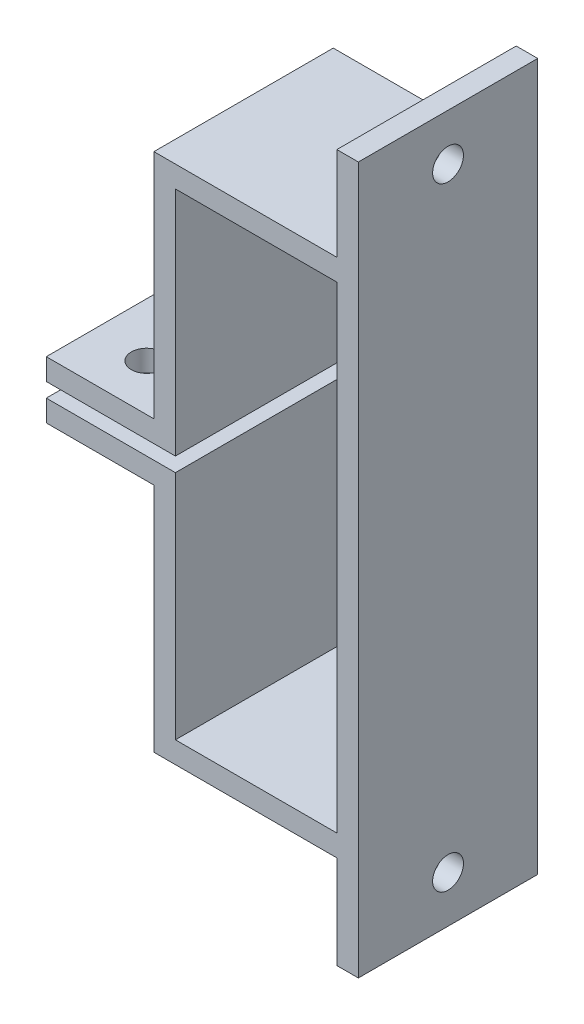
ISO-10303-21;
HEADER;
FILE_DESCRIPTION(('STEP AP214'),'2;1');
FILE_NAME('part.step','',(''),(''),'','','');
FILE_SCHEMA(('AUTOMOTIVE_DESIGN { 1 0 10303 214 1 1 1 1 }'));
ENDSEC;
DATA;
#1=APPLICATION_CONTEXT('core data for automotive mechanical design processes');
#2=APPLICATION_PROTOCOL_DEFINITION('international standard','automotive_design',2000,#1);
#3=PRODUCT_CONTEXT('',#1,'mechanical');
#4=PRODUCT('Part','Part','',(#3));
#5=PRODUCT_RELATED_PRODUCT_CATEGORY('part','',(#4));
#6=PRODUCT_DEFINITION_FORMATION('','',#4);
#7=PRODUCT_DEFINITION_CONTEXT('part definition',#1,'design');
#8=PRODUCT_DEFINITION('design','',#6,#7);
#9=PRODUCT_DEFINITION_SHAPE('','',#8);
#10=(LENGTH_UNIT() NAMED_UNIT(*) SI_UNIT(.MILLI.,.METRE.));
#11=(NAMED_UNIT(*) PLANE_ANGLE_UNIT() SI_UNIT($,.RADIAN.));
#12=(NAMED_UNIT(*) SI_UNIT($,.STERADIAN.) SOLID_ANGLE_UNIT());
#13=UNCERTAINTY_MEASURE_WITH_UNIT(LENGTH_MEASURE(1.E-05),#10,'distance_accuracy_value','');
#14=(GEOMETRIC_REPRESENTATION_CONTEXT(3) GLOBAL_UNCERTAINTY_ASSIGNED_CONTEXT((#13)) GLOBAL_UNIT_ASSIGNED_CONTEXT((#10,
#11,#12)) REPRESENTATION_CONTEXT('',''));
#15=CARTESIAN_POINT('',(0.,0.,0.));
#16=DIRECTION('',(0.,0.,1.));
#17=DIRECTION('',(1.,0.,0.));
#18=AXIS2_PLACEMENT_3D('',#15,#16,#17);
#19=CARTESIAN_POINT('',(-28.5,0.,25.));
#20=DIRECTION('',(0.,-1.,0.));
#21=DIRECTION('',(1.,0.,0.));
#22=AXIS2_PLACEMENT_3D('',#19,#20,#21);
#23=PLANE('',#22);
#24=DIRECTION('',(-1.,0.,0.));
#25=VECTOR('',#24,1.);
#26=CARTESIAN_POINT('',(-28.5,0.,25.));
#27=LINE('',#26,#25);
#28=CARTESIAN_POINT('',(-3.,0.,25.));
#29=VERTEX_POINT('',#28);
#30=CARTESIAN_POINT('',(-28.5,0.,25.));
#31=VERTEX_POINT('',#30);
#32=EDGE_CURVE('E196',#29,#31,#27,.T.);
#33=ORIENTED_EDGE('',*,*,#32,.F.);
#34=DIRECTION('',(0.,0.,-1.));
#35=VECTOR('',#34,1.);
#36=CARTESIAN_POINT('',(-3.,0.,25.));
#37=LINE('',#36,#35);
#38=CARTESIAN_POINT('',(-3.00000000000001,0.,0.));
#39=VERTEX_POINT('',#38);
#40=EDGE_CURVE('E233',#29,#39,#37,.T.);
#41=ORIENTED_EDGE('',*,*,#40,.T.);
#42=DIRECTION('',(-1.,0.,0.));
#43=VECTOR('',#42,1.);
#44=CARTESIAN_POINT('',(-28.5,0.,0.));
#45=LINE('',#44,#43);
#46=CARTESIAN_POINT('',(-28.5,0.,0.));
#47=VERTEX_POINT('',#46);
#48=EDGE_CURVE('E246',#39,#47,#45,.T.);
#49=ORIENTED_EDGE('',*,*,#48,.T.);
#50=DIRECTION('',(0.,0.,-1.));
#51=VECTOR('',#50,1.);
#52=CARTESIAN_POINT('',(-28.5,0.,25.));
#53=LINE('',#52,#51);
#54=EDGE_CURVE('E11',#31,#47,#53,.T.);
#55=ORIENTED_EDGE('',*,*,#54,.F.);
#56=EDGE_LOOP('',(#33,#41,#49,#55));
#57=FACE_BOUND('',#56,.T.);
#58=ADVANCED_FACE('F43',(#57),#23,.F.);
#59=CARTESIAN_POINT('',(-28.5,0.,25.));
#60=DIRECTION('',(1.,0.,0.));
#61=DIRECTION('',(0.,0.,-1.));
#62=AXIS2_PLACEMENT_3D('',#59,#60,#61);
#63=PLANE('',#62);
#64=DIRECTION('',(0.,-1.,0.));
#65=VECTOR('',#64,1.);
#66=CARTESIAN_POINT('',(-28.5,0.,0.));
#67=LINE('',#66,#65);
#68=CARTESIAN_POINT('',(-28.5,-32.25,0.));
#69=VERTEX_POINT('',#68);
#70=EDGE_CURVE('E299',#47,#69,#67,.T.);
#71=ORIENTED_EDGE('',*,*,#70,.T.);
#72=DIRECTION('',(0.,0.,-1.));
#73=VECTOR('',#72,1.);
#74=CARTESIAN_POINT('',(-28.5,-32.25,25.));
#75=LINE('',#74,#73);
#76=CARTESIAN_POINT('',(-28.5,-32.25,25.));
#77=VERTEX_POINT('',#76);
#78=EDGE_CURVE('E52',#77,#69,#75,.T.);
#79=ORIENTED_EDGE('',*,*,#78,.F.);
#80=DIRECTION('',(0.,-1.,0.));
#81=VECTOR('',#80,1.);
#82=CARTESIAN_POINT('',(-28.5,0.,25.));
#83=LINE('',#82,#81);
#84=EDGE_CURVE('E251',#31,#77,#83,.T.);
#85=ORIENTED_EDGE('',*,*,#84,.F.);
#86=ORIENTED_EDGE('',*,*,#54,.T.);
#87=EDGE_LOOP('',(#71,#79,#85,#86));
#88=FACE_BOUND('',#87,.T.);
#89=ADVANCED_FACE('F508',(#88),#63,.F.);
#90=CARTESIAN_POINT('',(-28.5,-32.25,25.));
#91=DIRECTION('',(0.,-1.,0.));
#92=DIRECTION('',(0.,0.,-1.));
#93=AXIS2_PLACEMENT_3D('',#90,#91,#92);
#94=PLANE('',#93);
#95=CARTESIAN_POINT('',(-36.,-32.25,6.5));
#96=DIRECTION('',(0.,-1.,0.));
#97=DIRECTION('',(0.,0.,-1.));
#98=AXIS2_PLACEMENT_3D('',#95,#96,#97);
#99=CIRCLE('',#98,2.15);
#100=CARTESIAN_POINT('',(-36.,-32.25,4.35));
#101=VERTEX_POINT('',#100);
#102=EDGE_CURVE('E418',#101,#101,#99,.T.);
#103=ORIENTED_EDGE('',*,*,#102,.T.);
#104=EDGE_LOOP('',(#103));
#105=FACE_BOUND('',#104,.T.);
#106=CARTESIAN_POINT('',(-36.,-32.25,18.5));
#107=DIRECTION('',(0.,-1.,0.));
#108=DIRECTION('',(0.,0.,-1.));
#109=AXIS2_PLACEMENT_3D('',#106,#107,#108);
#110=CIRCLE('',#109,2.15);
#111=CARTESIAN_POINT('',(-36.,-32.25,16.35));
#112=VERTEX_POINT('',#111);
#113=EDGE_CURVE('E404',#112,#112,#110,.T.);
#114=ORIENTED_EDGE('',*,*,#113,.T.);
#115=EDGE_LOOP('',(#114));
#116=FACE_BOUND('',#115,.T.);
#117=DIRECTION('',(-1.,0.,0.));
#118=VECTOR('',#117,1.);
#119=CARTESIAN_POINT('',(-28.5,-32.25,0.));
#120=LINE('',#119,#118);
#121=CARTESIAN_POINT('',(-43.5,-32.25,0.));
#122=VERTEX_POINT('',#121);
#123=EDGE_CURVE('E302',#69,#122,#120,.T.);
#124=ORIENTED_EDGE('',*,*,#123,.T.);
#125=DIRECTION('',(0.,0.,-1.));
#126=VECTOR('',#125,1.);
#127=CARTESIAN_POINT('',(-43.5,-32.25,25.));
#128=LINE('',#127,#126);
#129=CARTESIAN_POINT('',(-43.5,-32.25,25.));
#130=VERTEX_POINT('',#129);
#131=EDGE_CURVE('E384',#130,#122,#128,.T.);
#132=ORIENTED_EDGE('',*,*,#131,.F.);
#133=DIRECTION('',(-1.,0.,0.));
#134=VECTOR('',#133,1.);
#135=CARTESIAN_POINT('',(-28.5,-32.25,25.));
#136=LINE('',#135,#134);
#137=EDGE_CURVE('E254',#77,#130,#136,.T.);
#138=ORIENTED_EDGE('',*,*,#137,.F.);
#139=ORIENTED_EDGE('',*,*,#78,.T.);
#140=EDGE_LOOP('',(#124,#132,#138,#139));
#141=FACE_BOUND('',#140,.T.);
#142=ADVANCED_FACE('F503',(#105,#116,#141),#94,.F.);
#143=CARTESIAN_POINT('',(-43.5,-35.25,25.));
#144=DIRECTION('',(1.,0.,0.));
#145=DIRECTION('',(0.,0.,-1.));
#146=AXIS2_PLACEMENT_3D('',#143,#144,#145);
#147=PLANE('',#146);
#148=DIRECTION('',(0.,-1.,0.));
#149=VECTOR('',#148,1.);
#150=CARTESIAN_POINT('',(-43.5,-35.25,0.));
#151=LINE('',#150,#149);
#152=CARTESIAN_POINT('',(-43.5,-35.25,0.));
#153=VERTEX_POINT('',#152);
#154=EDGE_CURVE('E305',#122,#153,#151,.T.);
#155=ORIENTED_EDGE('',*,*,#154,.T.);
#156=DIRECTION('',(0.,0.,-1.));
#157=VECTOR('',#156,1.);
#158=CARTESIAN_POINT('',(-43.5,-35.25,25.));
#159=LINE('',#158,#157);
#160=CARTESIAN_POINT('',(-43.5,-35.25,25.));
#161=VERTEX_POINT('',#160);
#162=EDGE_CURVE('E380',#161,#153,#159,.T.);
#163=ORIENTED_EDGE('',*,*,#162,.F.);
#164=DIRECTION('',(0.,-1.,0.));
#165=VECTOR('',#164,1.);
#166=CARTESIAN_POINT('',(-43.5,-35.25,25.));
#167=LINE('',#166,#165);
#168=EDGE_CURVE('E257',#130,#161,#167,.T.);
#169=ORIENTED_EDGE('',*,*,#168,.F.);
#170=ORIENTED_EDGE('',*,*,#131,.T.);
#171=EDGE_LOOP('',(#155,#163,#169,#170));
#172=FACE_BOUND('',#171,.T.);
#173=ADVANCED_FACE('F498',(#172),#147,.F.);
#174=CARTESIAN_POINT('',(-25.5,-35.25,25.));
#175=DIRECTION('',(0.,1.,0.));
#176=DIRECTION('',(0.,0.,1.));
#177=AXIS2_PLACEMENT_3D('',#174,#175,#176);
#178=PLANE('',#177);
#179=CARTESIAN_POINT('',(-36.,-35.25,6.5));
#180=DIRECTION('',(0.,1.,0.));
#181=DIRECTION('',(0.,0.,1.));
#182=AXIS2_PLACEMENT_3D('',#179,#180,#181);
#183=CIRCLE('',#182,2.15);
#184=CARTESIAN_POINT('',(-36.,-35.25,8.65));
#185=VERTEX_POINT('',#184);
#186=EDGE_CURVE('E414',#185,#185,#183,.T.);
#187=ORIENTED_EDGE('',*,*,#186,.T.);
#188=EDGE_LOOP('',(#187));
#189=FACE_BOUND('',#188,.T.);
#190=CARTESIAN_POINT('',(-36.,-35.25,18.5));
#191=DIRECTION('',(0.,1.,0.));
#192=DIRECTION('',(0.,0.,1.));
#193=AXIS2_PLACEMENT_3D('',#190,#191,#192);
#194=CIRCLE('',#193,2.15);
#195=CARTESIAN_POINT('',(-36.,-35.25,20.65));
#196=VERTEX_POINT('',#195);
#197=EDGE_CURVE('E398',#196,#196,#194,.T.);
#198=ORIENTED_EDGE('',*,*,#197,.T.);
#199=EDGE_LOOP('',(#198));
#200=FACE_BOUND('',#199,.T.);
#201=DIRECTION('',(1.,0.,0.));
#202=VECTOR('',#201,1.);
#203=CARTESIAN_POINT('',(-25.5,-35.25,0.));
#204=LINE('',#203,#202);
#205=CARTESIAN_POINT('',(-25.5,-35.25,0.));
#206=VERTEX_POINT('',#205);
#207=EDGE_CURVE('E308',#153,#206,#204,.T.);
#208=ORIENTED_EDGE('',*,*,#207,.T.);
#209=DIRECTION('',(0.,0.,-1.));
#210=VECTOR('',#209,1.);
#211=CARTESIAN_POINT('',(-25.5,-35.25,25.));
#212=LINE('',#211,#210);
#213=CARTESIAN_POINT('',(-25.5,-35.25,25.));
#214=VERTEX_POINT('',#213);
#215=EDGE_CURVE('E376',#214,#206,#212,.T.);
#216=ORIENTED_EDGE('',*,*,#215,.F.);
#217=DIRECTION('',(1.,0.,0.));
#218=VECTOR('',#217,1.);
#219=CARTESIAN_POINT('',(-25.5,-35.25,25.));
#220=LINE('',#219,#218);
#221=EDGE_CURVE('E260',#161,#214,#220,.T.);
#222=ORIENTED_EDGE('',*,*,#221,.F.);
#223=ORIENTED_EDGE('',*,*,#162,.T.);
#224=EDGE_LOOP('',(#208,#216,#222,#223));
#225=FACE_BOUND('',#224,.T.);
#226=ADVANCED_FACE('F494',(#189,#200,#225),#178,.F.);
#227=CARTESIAN_POINT('',(-25.5,-3.,25.));
#228=DIRECTION('',(-1.,0.,0.));
#229=DIRECTION('',(0.,0.,1.));
#230=AXIS2_PLACEMENT_3D('',#227,#228,#229);
#231=PLANE('',#230);
#232=DIRECTION('',(0.,1.,0.));
#233=VECTOR('',#232,1.);
#234=CARTESIAN_POINT('',(-25.5,-3.,0.));
#235=LINE('',#234,#233);
#236=CARTESIAN_POINT('',(-25.5,-3.,0.));
#237=VERTEX_POINT('',#236);
#238=EDGE_CURVE('E311',#206,#237,#235,.T.);
#239=ORIENTED_EDGE('',*,*,#238,.T.);
#240=DIRECTION('',(0.,0.,-1.));
#241=VECTOR('',#240,1.);
#242=CARTESIAN_POINT('',(-25.5,-3.,25.));
#243=LINE('',#242,#241);
#244=CARTESIAN_POINT('',(-25.5,-3.,25.));
#245=VERTEX_POINT('',#244);
#246=EDGE_CURVE('E372',#245,#237,#243,.T.);
#247=ORIENTED_EDGE('',*,*,#246,.F.);
#248=DIRECTION('',(0.,1.,0.));
#249=VECTOR('',#248,1.);
#250=CARTESIAN_POINT('',(-25.5,-3.,25.));
#251=LINE('',#250,#249);
#252=EDGE_CURVE('E263',#214,#245,#251,.T.);
#253=ORIENTED_EDGE('',*,*,#252,.F.);
#254=ORIENTED_EDGE('',*,*,#215,.T.);
#255=EDGE_LOOP('',(#239,#247,#253,#254));
#256=FACE_BOUND('',#255,.T.);
#257=ADVANCED_FACE('F489',(#256),#231,.F.);
#258=CARTESIAN_POINT('',(-2.99999999999999,-2.99999999999999,25.));
#259=DIRECTION('',(0.,1.,0.));
#260=DIRECTION('',(-1.,0.,0.));
#261=AXIS2_PLACEMENT_3D('',#258,#259,#260);
#262=PLANE('',#261);
#263=DIRECTION('',(1.,0.,0.));
#264=VECTOR('',#263,1.);
#265=CARTESIAN_POINT('',(-2.99999999999999,-2.99999999999999,0.));
#266=LINE('',#265,#264);
#267=CARTESIAN_POINT('',(-2.99999999999999,-2.99999999999999,0.));
#268=VERTEX_POINT('',#267);
#269=EDGE_CURVE('E314',#237,#268,#266,.T.);
#270=ORIENTED_EDGE('',*,*,#269,.T.);
#271=DIRECTION('',(0.,0.,-1.));
#272=VECTOR('',#271,1.);
#273=CARTESIAN_POINT('',(-2.99999999999999,-2.99999999999999,25.));
#274=LINE('',#273,#272);
#275=CARTESIAN_POINT('',(-2.99999999999999,-2.99999999999999,25.));
#276=VERTEX_POINT('',#275);
#277=EDGE_CURVE('E368',#276,#268,#274,.T.);
#278=ORIENTED_EDGE('',*,*,#277,.F.);
#279=DIRECTION('',(1.,0.,0.));
#280=VECTOR('',#279,1.);
#281=CARTESIAN_POINT('',(-2.99999999999999,-2.99999999999999,25.));
#282=LINE('',#281,#280);
#283=EDGE_CURVE('E266',#245,#276,#282,.T.);
#284=ORIENTED_EDGE('',*,*,#283,.F.);
#285=ORIENTED_EDGE('',*,*,#246,.T.);
#286=EDGE_LOOP('',(#270,#278,#284,#285));
#287=FACE_BOUND('',#286,.T.);
#288=ADVANCED_FACE('F483',(#287),#262,.F.);
#289=CARTESIAN_POINT('',(-2.99999999999999,-69.5,25.));
#290=DIRECTION('',(1.,0.,0.));
#291=DIRECTION('',(0.,1.,0.));
#292=AXIS2_PLACEMENT_3D('',#289,#290,#291);
#293=PLANE('',#292);
#294=DIRECTION('',(0.,-1.,0.));
#295=VECTOR('',#294,1.);
#296=CARTESIAN_POINT('',(-2.99999999999999,-69.5,0.));
#297=LINE('',#296,#295);
#298=CARTESIAN_POINT('',(-2.99999999999999,-69.5,0.));
#299=VERTEX_POINT('',#298);
#300=EDGE_CURVE('E317',#268,#299,#297,.T.);
#301=ORIENTED_EDGE('',*,*,#300,.T.);
#302=DIRECTION('',(0.,0.,-1.));
#303=VECTOR('',#302,1.);
#304=CARTESIAN_POINT('',(-2.99999999999999,-69.5,25.));
#305=LINE('',#304,#303);
#306=CARTESIAN_POINT('',(-2.99999999999999,-69.5,25.));
#307=VERTEX_POINT('',#306);
#308=EDGE_CURVE('E364',#307,#299,#305,.T.);
#309=ORIENTED_EDGE('',*,*,#308,.F.);
#310=DIRECTION('',(0.,-1.,0.));
#311=VECTOR('',#310,1.);
#312=CARTESIAN_POINT('',(-2.99999999999999,-69.5,25.));
#313=LINE('',#312,#311);
#314=EDGE_CURVE('E269',#276,#307,#313,.T.);
#315=ORIENTED_EDGE('',*,*,#314,.F.);
#316=ORIENTED_EDGE('',*,*,#277,.T.);
#317=EDGE_LOOP('',(#301,#309,#315,#316));
#318=FACE_BOUND('',#317,.T.);
#319=ADVANCED_FACE('F479',(#318),#293,.F.);
#320=CARTESIAN_POINT('',(-25.5,-69.5,25.));
#321=DIRECTION('',(0.,-1.,0.));
#322=DIRECTION('',(0.,0.,-1.));
#323=AXIS2_PLACEMENT_3D('',#320,#321,#322);
#324=PLANE('',#323);
#325=DIRECTION('',(-1.,0.,0.));
#326=VECTOR('',#325,1.);
#327=CARTESIAN_POINT('',(-25.5,-69.5,0.));
#328=LINE('',#327,#326);
#329=CARTESIAN_POINT('',(-25.5,-69.5,0.));
#330=VERTEX_POINT('',#329);
#331=EDGE_CURVE('E320',#299,#330,#328,.T.);
#332=ORIENTED_EDGE('',*,*,#331,.T.);
#333=DIRECTION('',(0.,0.,-1.));
#334=VECTOR('',#333,1.);
#335=CARTESIAN_POINT('',(-25.5,-69.5,25.));
#336=LINE('',#335,#334);
#337=CARTESIAN_POINT('',(-25.5,-69.5,25.));
#338=VERTEX_POINT('',#337);
#339=EDGE_CURVE('E360',#338,#330,#336,.T.);
#340=ORIENTED_EDGE('',*,*,#339,.F.);
#341=DIRECTION('',(-1.,0.,0.));
#342=VECTOR('',#341,1.);
#343=CARTESIAN_POINT('',(-25.5,-69.5,25.));
#344=LINE('',#343,#342);
#345=EDGE_CURVE('E272',#307,#338,#344,.T.);
#346=ORIENTED_EDGE('',*,*,#345,.F.);
#347=ORIENTED_EDGE('',*,*,#308,.T.);
#348=EDGE_LOOP('',(#332,#340,#346,#347));
#349=FACE_BOUND('',#348,.T.);
#350=ADVANCED_FACE('F474',(#349),#324,.F.);
#351=CARTESIAN_POINT('',(-25.5,-37.25,25.));
#352=DIRECTION('',(-1.,0.,0.));
#353=DIRECTION('',(0.,-1.,0.));
#354=AXIS2_PLACEMENT_3D('',#351,#352,#353);
#355=PLANE('',#354);
#356=DIRECTION('',(0.,1.,0.));
#357=VECTOR('',#356,1.);
#358=CARTESIAN_POINT('',(-25.5,-37.25,0.));
#359=LINE('',#358,#357);
#360=CARTESIAN_POINT('',(-25.5,-37.25,0.));
#361=VERTEX_POINT('',#360);
#362=EDGE_CURVE('E323',#330,#361,#359,.T.);
#363=ORIENTED_EDGE('',*,*,#362,.T.);
#364=DIRECTION('',(0.,0.,-1.));
#365=VECTOR('',#364,1.);
#366=CARTESIAN_POINT('',(-25.5,-37.25,25.));
#367=LINE('',#366,#365);
#368=CARTESIAN_POINT('',(-25.5,-37.25,25.));
#369=VERTEX_POINT('',#368);
#370=EDGE_CURVE('E356',#369,#361,#367,.T.);
#371=ORIENTED_EDGE('',*,*,#370,.F.);
#372=DIRECTION('',(0.,1.,0.));
#373=VECTOR('',#372,1.);
#374=CARTESIAN_POINT('',(-25.5,-37.25,25.));
#375=LINE('',#374,#373);
#376=EDGE_CURVE('E275',#338,#369,#375,.T.);
#377=ORIENTED_EDGE('',*,*,#376,.F.);
#378=ORIENTED_EDGE('',*,*,#339,.T.);
#379=EDGE_LOOP('',(#363,#371,#377,#378));
#380=FACE_BOUND('',#379,.T.);
#381=ADVANCED_FACE('F468',(#380),#355,.F.);
#382=CARTESIAN_POINT('',(-43.5,-37.25,25.));
#383=DIRECTION('',(0.,-1.,0.));
#384=DIRECTION('',(0.,0.,-1.));
#385=AXIS2_PLACEMENT_3D('',#382,#383,#384);
#386=PLANE('',#385);
#387=CARTESIAN_POINT('',(-36.,-37.25,6.5));
#388=DIRECTION('',(0.,-1.,0.));
#389=DIRECTION('',(0.,0.,-1.));
#390=AXIS2_PLACEMENT_3D('',#387,#388,#389);
#391=CIRCLE('',#390,2.15);
#392=CARTESIAN_POINT('',(-36.,-37.25,4.35));
#393=VERTEX_POINT('',#392);
#394=EDGE_CURVE('E410',#393,#393,#391,.T.);
#395=ORIENTED_EDGE('',*,*,#394,.T.);
#396=EDGE_LOOP('',(#395));
#397=FACE_BOUND('',#396,.T.);
#398=CARTESIAN_POINT('',(-36.,-37.25,18.5));
#399=DIRECTION('',(0.,-1.,0.));
#400=DIRECTION('',(0.,0.,-1.));
#401=AXIS2_PLACEMENT_3D('',#398,#399,#400);
#402=CIRCLE('',#401,2.15);
#403=CARTESIAN_POINT('',(-36.,-37.25,16.35));
#404=VERTEX_POINT('',#403);
#405=EDGE_CURVE('E393',#404,#404,#402,.T.);
#406=ORIENTED_EDGE('',*,*,#405,.T.);
#407=EDGE_LOOP('',(#406));
#408=FACE_BOUND('',#407,.T.);
#409=DIRECTION('',(-1.,0.,0.));
#410=VECTOR('',#409,1.);
#411=CARTESIAN_POINT('',(-43.5,-37.25,0.));
#412=LINE('',#411,#410);
#413=CARTESIAN_POINT('',(-43.5,-37.25,0.));
#414=VERTEX_POINT('',#413);
#415=EDGE_CURVE('E326',#361,#414,#412,.T.);
#416=ORIENTED_EDGE('',*,*,#415,.T.);
#417=DIRECTION('',(0.,0.,-1.));
#418=VECTOR('',#417,1.);
#419=CARTESIAN_POINT('',(-43.5,-37.25,25.));
#420=LINE('',#419,#418);
#421=CARTESIAN_POINT('',(-43.5,-37.25,25.));
#422=VERTEX_POINT('',#421);
#423=EDGE_CURVE('E352',#422,#414,#420,.T.);
#424=ORIENTED_EDGE('',*,*,#423,.F.);
#425=DIRECTION('',(-1.,0.,0.));
#426=VECTOR('',#425,1.);
#427=CARTESIAN_POINT('',(-43.5,-37.25,25.));
#428=LINE('',#427,#426);
#429=EDGE_CURVE('E278',#369,#422,#428,.T.);
#430=ORIENTED_EDGE('',*,*,#429,.F.);
#431=ORIENTED_EDGE('',*,*,#370,.T.);
#432=EDGE_LOOP('',(#416,#424,#430,#431));
#433=FACE_BOUND('',#432,.T.);
#434=ADVANCED_FACE('F464',(#397,#408,#433),#386,.F.);
#435=CARTESIAN_POINT('',(-43.5,-40.25,25.));
#436=DIRECTION('',(1.,0.,0.));
#437=DIRECTION('',(0.,0.,-1.));
#438=AXIS2_PLACEMENT_3D('',#435,#436,#437);
#439=PLANE('',#438);
#440=DIRECTION('',(0.,-1.,0.));
#441=VECTOR('',#440,1.);
#442=CARTESIAN_POINT('',(-43.5,-40.25,0.));
#443=LINE('',#442,#441);
#444=CARTESIAN_POINT('',(-43.5,-40.25,0.));
#445=VERTEX_POINT('',#444);
#446=EDGE_CURVE('E329',#414,#445,#443,.T.);
#447=ORIENTED_EDGE('',*,*,#446,.T.);
#448=DIRECTION('',(0.,0.,-1.));
#449=VECTOR('',#448,1.);
#450=CARTESIAN_POINT('',(-43.5,-40.25,25.));
#451=LINE('',#450,#449);
#452=CARTESIAN_POINT('',(-43.5,-40.25,25.));
#453=VERTEX_POINT('',#452);
#454=EDGE_CURVE('E348',#453,#445,#451,.T.);
#455=ORIENTED_EDGE('',*,*,#454,.F.);
#456=DIRECTION('',(0.,-1.,0.));
#457=VECTOR('',#456,1.);
#458=CARTESIAN_POINT('',(-43.5,-40.25,25.));
#459=LINE('',#458,#457);
#460=EDGE_CURVE('E281',#422,#453,#459,.T.);
#461=ORIENTED_EDGE('',*,*,#460,.F.);
#462=ORIENTED_EDGE('',*,*,#423,.T.);
#463=EDGE_LOOP('',(#447,#455,#461,#462));
#464=FACE_BOUND('',#463,.T.);
#465=ADVANCED_FACE('F459',(#464),#439,.F.);
#466=CARTESIAN_POINT('',(-28.5,-40.25,25.));
#467=DIRECTION('',(0.,1.,0.));
#468=DIRECTION('',(0.,0.,1.));
#469=AXIS2_PLACEMENT_3D('',#466,#467,#468);
#470=PLANE('',#469);
#471=CARTESIAN_POINT('',(-36.,-40.25,6.5));
#472=DIRECTION('',(0.,1.,0.));
#473=DIRECTION('',(0.,0.,1.));
#474=AXIS2_PLACEMENT_3D('',#471,#472,#473);
#475=CIRCLE('',#474,2.15);
#476=CARTESIAN_POINT('',(-36.,-40.25,8.65));
#477=VERTEX_POINT('',#476);
#478=EDGE_CURVE('E46',#477,#477,#475,.T.);
#479=ORIENTED_EDGE('',*,*,#478,.T.);
#480=EDGE_LOOP('',(#479));
#481=FACE_BOUND('',#480,.T.);
#482=CARTESIAN_POINT('',(-36.,-40.25,18.5));
#483=DIRECTION('',(0.,1.,0.));
#484=DIRECTION('',(0.,0.,1.));
#485=AXIS2_PLACEMENT_3D('',#482,#483,#484);
#486=CIRCLE('',#485,2.15);
#487=CARTESIAN_POINT('',(-36.,-40.25,20.65));
#488=VERTEX_POINT('',#487);
#489=EDGE_CURVE('E390',#488,#488,#486,.T.);
#490=ORIENTED_EDGE('',*,*,#489,.T.);
#491=EDGE_LOOP('',(#490));
#492=FACE_BOUND('',#491,.T.);
#493=DIRECTION('',(1.,0.,0.));
#494=VECTOR('',#493,1.);
#495=CARTESIAN_POINT('',(-28.5,-40.25,0.));
#496=LINE('',#495,#494);
#497=CARTESIAN_POINT('',(-28.5,-40.25,0.));
#498=VERTEX_POINT('',#497);
#499=EDGE_CURVE('E332',#445,#498,#496,.T.);
#500=ORIENTED_EDGE('',*,*,#499,.T.);
#501=DIRECTION('',(0.,0.,-1.));
#502=VECTOR('',#501,1.);
#503=CARTESIAN_POINT('',(-28.5,-40.25,25.));
#504=LINE('',#503,#502);
#505=CARTESIAN_POINT('',(-28.5,-40.25,25.));
#506=VERTEX_POINT('',#505);
#507=EDGE_CURVE('E344',#506,#498,#504,.T.);
#508=ORIENTED_EDGE('',*,*,#507,.F.);
#509=DIRECTION('',(1.,0.,0.));
#510=VECTOR('',#509,1.);
#511=CARTESIAN_POINT('',(-28.5,-40.25,25.));
#512=LINE('',#511,#510);
#513=EDGE_CURVE('E284',#453,#506,#512,.T.);
#514=ORIENTED_EDGE('',*,*,#513,.F.);
#515=ORIENTED_EDGE('',*,*,#454,.T.);
#516=EDGE_LOOP('',(#500,#508,#514,#515));
#517=FACE_BOUND('',#516,.T.);
#518=ADVANCED_FACE('F453',(#481,#492,#517),#470,.F.);
#519=CARTESIAN_POINT('',(-28.5,-72.5,25.));
#520=DIRECTION('',(1.,0.,0.));
#521=DIRECTION('',(0.,0.,-1.));
#522=AXIS2_PLACEMENT_3D('',#519,#520,#521);
#523=PLANE('',#522);
#524=DIRECTION('',(0.,-1.,0.));
#525=VECTOR('',#524,1.);
#526=CARTESIAN_POINT('',(-28.5,-72.5,0.));
#527=LINE('',#526,#525);
#528=CARTESIAN_POINT('',(-28.5,-72.5,0.));
#529=VERTEX_POINT('',#528);
#530=EDGE_CURVE('E335',#498,#529,#527,.T.);
#531=ORIENTED_EDGE('',*,*,#530,.T.);
#532=DIRECTION('',(0.,0.,-1.));
#533=VECTOR('',#532,1.);
#534=CARTESIAN_POINT('',(-28.5,-72.5,25.));
#535=LINE('',#534,#533);
#536=CARTESIAN_POINT('',(-28.5,-72.5,25.));
#537=VERTEX_POINT('',#536);
#538=EDGE_CURVE('E296',#537,#529,#535,.T.);
#539=ORIENTED_EDGE('',*,*,#538,.F.);
#540=DIRECTION('',(0.,-1.,0.));
#541=VECTOR('',#540,1.);
#542=CARTESIAN_POINT('',(-28.5,-72.5,25.));
#543=LINE('',#542,#541);
#544=EDGE_CURVE('E287',#506,#537,#543,.T.);
#545=ORIENTED_EDGE('',*,*,#544,.F.);
#546=ORIENTED_EDGE('',*,*,#507,.T.);
#547=EDGE_LOOP('',(#531,#539,#545,#546));
#548=FACE_BOUND('',#547,.T.);
#549=ADVANCED_FACE('F449',(#548),#523,.F.);
#550=CARTESIAN_POINT('',(0.,-72.5,25.));
#551=DIRECTION('',(0.,1.,0.));
#552=DIRECTION('',(0.,0.,1.));
#553=AXIS2_PLACEMENT_3D('',#550,#551,#552);
#554=PLANE('',#553);
#555=DIRECTION('',(1.,0.,0.));
#556=VECTOR('',#555,1.);
#557=CARTESIAN_POINT('',(0.,-72.5,0.));
#558=LINE('',#557,#556);
#559=CARTESIAN_POINT('',(-2.99999999999999,-72.5,0.));
#560=VERTEX_POINT('',#559);
#561=EDGE_CURVE('E197',#529,#560,#558,.T.);
#562=ORIENTED_EDGE('',*,*,#561,.T.);
#563=DIRECTION('',(0.,0.,1.));
#564=VECTOR('',#563,1.);
#565=CARTESIAN_POINT('',(-2.99999999999999,-72.5,25.));
#566=LINE('',#565,#564);
#567=CARTESIAN_POINT('',(-2.99999999999999,-72.5,25.));
#568=VERTEX_POINT('',#567);
#569=EDGE_CURVE('E222',#560,#568,#566,.T.);
#570=ORIENTED_EDGE('',*,*,#569,.T.);
#571=DIRECTION('',(1.,0.,0.));
#572=VECTOR('',#571,1.);
#573=CARTESIAN_POINT('',(0.,-72.5,25.));
#574=LINE('',#573,#572);
#575=EDGE_CURVE('E290',#537,#568,#574,.T.);
#576=ORIENTED_EDGE('',*,*,#575,.F.);
#577=ORIENTED_EDGE('',*,*,#538,.T.);
#578=EDGE_LOOP('',(#562,#570,#576,#577));
#579=FACE_BOUND('',#578,.T.);
#580=ADVANCED_FACE('F444',(#579),#554,.F.);
#581=CARTESIAN_POINT('',(0.,0.,25.));
#582=DIRECTION('',(-1.,0.,0.));
#583=DIRECTION('',(0.,-1.,0.));
#584=AXIS2_PLACEMENT_3D('',#581,#582,#583);
#585=PLANE('',#584);
#586=CARTESIAN_POINT('',(0.,6.5,12.5));
#587=DIRECTION('',(-1.,0.,0.));
#588=DIRECTION('',(0.,-1.,0.));
#589=AXIS2_PLACEMENT_3D('',#586,#587,#588);
#590=CIRCLE('',#589,2.15);
#591=CARTESIAN_POINT('',(0.,4.35,12.5));
#592=VERTEX_POINT('',#591);
#593=EDGE_CURVE('E207',#592,#592,#590,.T.);
#594=ORIENTED_EDGE('',*,*,#593,.T.);
#595=EDGE_LOOP('',(#594));
#596=FACE_BOUND('',#595,.T.);
#597=CARTESIAN_POINT('',(0.,-79.,12.5));
#598=DIRECTION('',(-1.,0.,0.));
#599=DIRECTION('',(0.,-1.,0.));
#600=AXIS2_PLACEMENT_3D('',#597,#598,#599);
#601=CIRCLE('',#600,2.15);
#602=CARTESIAN_POINT('',(0.,-81.15,12.5));
#603=VERTEX_POINT('',#602);
#604=EDGE_CURVE('E422',#603,#603,#601,.T.);
#605=ORIENTED_EDGE('',*,*,#604,.T.);
#606=EDGE_LOOP('',(#605));
#607=FACE_BOUND('',#606,.T.);
#608=DIRECTION('',(0.,1.,0.));
#609=VECTOR('',#608,1.);
#610=CARTESIAN_POINT('',(0.,0.,0.));
#611=LINE('',#610,#609);
#612=CARTESIAN_POINT('',(0.,-85.5,0.));
#613=VERTEX_POINT('',#612);
#614=CARTESIAN_POINT('',(0.,13.,0.));
#615=VERTEX_POINT('',#614);
#616=EDGE_CURVE('E184',#613,#615,#611,.T.);
#617=ORIENTED_EDGE('',*,*,#616,.T.);
#618=DIRECTION('',(0.,0.,1.));
#619=VECTOR('',#618,1.);
#620=CARTESIAN_POINT('',(0.,13.,25.));
#621=LINE('',#620,#619);
#622=CARTESIAN_POINT('',(0.,13.,25.));
#623=VERTEX_POINT('',#622);
#624=EDGE_CURVE('E213',#615,#623,#621,.T.);
#625=ORIENTED_EDGE('',*,*,#624,.T.);
#626=DIRECTION('',(0.,1.,0.));
#627=VECTOR('',#626,1.);
#628=CARTESIAN_POINT('',(0.,0.,25.));
#629=LINE('',#628,#627);
#630=CARTESIAN_POINT('',(0.,-85.5,25.));
#631=VERTEX_POINT('',#630);
#632=EDGE_CURVE('E210',#631,#623,#629,.T.);
#633=ORIENTED_EDGE('',*,*,#632,.F.);
#634=DIRECTION('',(0.,0.,-1.));
#635=VECTOR('',#634,1.);
#636=CARTESIAN_POINT('',(0.,-85.5,25.));
#637=LINE('',#636,#635);
#638=EDGE_CURVE('E203',#631,#613,#637,.T.);
#639=ORIENTED_EDGE('',*,*,#638,.T.);
#640=EDGE_LOOP('',(#617,#625,#633,#639));
#641=FACE_BOUND('',#640,.T.);
#642=ADVANCED_FACE('F209',(#596,#607,#641),#585,.F.);
#643=CARTESIAN_POINT('',(0.,0.,25.));
#644=DIRECTION('',(0.,0.,-1.));
#645=DIRECTION('',(-1.,0.,0.));
#646=AXIS2_PLACEMENT_3D('',#643,#644,#645);
#647=PLANE('',#646);
#648=ORIENTED_EDGE('',*,*,#632,.T.);
#649=DIRECTION('',(1.,0.,0.));
#650=VECTOR('',#649,1.);
#651=CARTESIAN_POINT('',(-3.,13.,25.));
#652=LINE('',#651,#650);
#653=CARTESIAN_POINT('',(-3.,13.,25.));
#654=VERTEX_POINT('',#653);
#655=EDGE_CURVE('E242',#654,#623,#652,.T.);
#656=ORIENTED_EDGE('',*,*,#655,.F.);
#657=DIRECTION('',(0.,-1.,0.));
#658=VECTOR('',#657,1.);
#659=CARTESIAN_POINT('',(-3.,0.,25.));
#660=LINE('',#659,#658);
#661=EDGE_CURVE('E217',#654,#29,#660,.T.);
#662=ORIENTED_EDGE('',*,*,#661,.T.);
#663=ORIENTED_EDGE('',*,*,#32,.T.);
#664=ORIENTED_EDGE('',*,*,#84,.T.);
#665=ORIENTED_EDGE('',*,*,#137,.T.);
#666=ORIENTED_EDGE('',*,*,#168,.T.);
#667=ORIENTED_EDGE('',*,*,#221,.T.);
#668=ORIENTED_EDGE('',*,*,#252,.T.);
#669=ORIENTED_EDGE('',*,*,#283,.T.);
#670=ORIENTED_EDGE('',*,*,#314,.T.);
#671=ORIENTED_EDGE('',*,*,#345,.T.);
#672=ORIENTED_EDGE('',*,*,#376,.T.);
#673=ORIENTED_EDGE('',*,*,#429,.T.);
#674=ORIENTED_EDGE('',*,*,#460,.T.);
#675=ORIENTED_EDGE('',*,*,#513,.T.);
#676=ORIENTED_EDGE('',*,*,#544,.T.);
#677=ORIENTED_EDGE('',*,*,#575,.T.);
#678=DIRECTION('',(0.,-1.,0.));
#679=VECTOR('',#678,1.);
#680=CARTESIAN_POINT('',(-2.99999999999999,-72.5,25.));
#681=LINE('',#680,#679);
#682=CARTESIAN_POINT('',(-2.99999999999999,-85.5,25.));
#683=VERTEX_POINT('',#682);
#684=EDGE_CURVE('E60',#568,#683,#681,.T.);
#685=ORIENTED_EDGE('',*,*,#684,.T.);
#686=DIRECTION('',(1.,0.,0.));
#687=VECTOR('',#686,1.);
#688=CARTESIAN_POINT('',(-2.99999999999999,-85.5,25.));
#689=LINE('',#688,#687);
#690=EDGE_CURVE('E206',#683,#631,#689,.T.);
#691=ORIENTED_EDGE('',*,*,#690,.T.);
#692=EDGE_LOOP('',(#648,#656,#662,#663,#664,#665,#666,#667,#668,#669,#670,#671,#672,#673,#674,
#675,#676,#677,#685,#691));
#693=FACE_BOUND('',#692,.T.);
#694=ADVANCED_FACE('F438',(#693),#647,.F.);
#695=CARTESIAN_POINT('',(0.,0.,0.));
#696=DIRECTION('',(0.,0.,-1.));
#697=DIRECTION('',(-1.,0.,0.));
#698=AXIS2_PLACEMENT_3D('',#695,#696,#697);
#699=PLANE('',#698);
#700=ORIENTED_EDGE('',*,*,#48,.F.);
#701=DIRECTION('',(0.,1.,0.));
#702=VECTOR('',#701,1.);
#703=CARTESIAN_POINT('',(-3.,0.,0.));
#704=LINE('',#703,#702);
#705=CARTESIAN_POINT('',(-3.,13.,0.));
#706=VERTEX_POINT('',#705);
#707=EDGE_CURVE('E68',#39,#706,#704,.T.);
#708=ORIENTED_EDGE('',*,*,#707,.T.);
#709=DIRECTION('',(1.,0.,0.));
#710=VECTOR('',#709,1.);
#711=CARTESIAN_POINT('',(-3.,13.,0.));
#712=LINE('',#711,#710);
#713=EDGE_CURVE('E190',#706,#615,#712,.T.);
#714=ORIENTED_EDGE('',*,*,#713,.T.);
#715=ORIENTED_EDGE('',*,*,#616,.F.);
#716=DIRECTION('',(1.,0.,0.));
#717=VECTOR('',#716,1.);
#718=CARTESIAN_POINT('',(-2.99999999999999,-85.5,0.));
#719=LINE('',#718,#717);
#720=CARTESIAN_POINT('',(-2.99999999999999,-85.5,0.));
#721=VERTEX_POINT('',#720);
#722=EDGE_CURVE('E188',#721,#613,#719,.T.);
#723=ORIENTED_EDGE('',*,*,#722,.F.);
#724=DIRECTION('',(0.,1.,0.));
#725=VECTOR('',#724,1.);
#726=CARTESIAN_POINT('',(-2.99999999999999,-72.5,0.));
#727=LINE('',#726,#725);
#728=EDGE_CURVE('E225',#721,#560,#727,.T.);
#729=ORIENTED_EDGE('',*,*,#728,.T.);
#730=ORIENTED_EDGE('',*,*,#561,.F.);
#731=ORIENTED_EDGE('',*,*,#530,.F.);
#732=ORIENTED_EDGE('',*,*,#499,.F.);
#733=ORIENTED_EDGE('',*,*,#446,.F.);
#734=ORIENTED_EDGE('',*,*,#415,.F.);
#735=ORIENTED_EDGE('',*,*,#362,.F.);
#736=ORIENTED_EDGE('',*,*,#331,.F.);
#737=ORIENTED_EDGE('',*,*,#300,.F.);
#738=ORIENTED_EDGE('',*,*,#269,.F.);
#739=ORIENTED_EDGE('',*,*,#238,.F.);
#740=ORIENTED_EDGE('',*,*,#207,.F.);
#741=ORIENTED_EDGE('',*,*,#154,.F.);
#742=ORIENTED_EDGE('',*,*,#123,.F.);
#743=ORIENTED_EDGE('',*,*,#70,.F.);
#744=EDGE_LOOP('',(#700,#708,#714,#715,#723,#729,#730,#731,#732,#733,#734,#735,#736,#737,#738,
#739,#740,#741,#742,#743));
#745=FACE_BOUND('',#744,.T.);
#746=ADVANCED_FACE('F187',(#745),#699,.T.);
#747=CARTESIAN_POINT('',(-3.,13.,25.));
#748=DIRECTION('',(0.,1.,0.));
#749=DIRECTION('',(-1.,0.,0.));
#750=AXIS2_PLACEMENT_3D('',#747,#748,#749);
#751=PLANE('',#750);
#752=ORIENTED_EDGE('',*,*,#624,.F.);
#753=ORIENTED_EDGE('',*,*,#713,.F.);
#754=DIRECTION('',(0.,0.,1.));
#755=VECTOR('',#754,1.);
#756=CARTESIAN_POINT('',(-3.,13.,25.));
#757=LINE('',#756,#755);
#758=EDGE_CURVE('E238',#706,#654,#757,.T.);
#759=ORIENTED_EDGE('',*,*,#758,.T.);
#760=ORIENTED_EDGE('',*,*,#655,.T.);
#761=EDGE_LOOP('',(#752,#753,#759,#760));
#762=FACE_BOUND('',#761,.T.);
#763=ADVANCED_FACE('F515',(#762),#751,.T.);
#764=CARTESIAN_POINT('',(-3.,0.,0.));
#765=DIRECTION('',(-1.,0.,0.));
#766=DIRECTION('',(0.,-1.,0.));
#767=AXIS2_PLACEMENT_3D('',#764,#765,#766);
#768=PLANE('',#767);
#769=CARTESIAN_POINT('',(-3.,6.5,12.5));
#770=DIRECTION('',(-1.,0.,0.));
#771=DIRECTION('',(0.,-1.,0.));
#772=AXIS2_PLACEMENT_3D('',#769,#770,#771);
#773=CIRCLE('',#772,2.15);
#774=CARTESIAN_POINT('',(-3.,4.35,12.5));
#775=VERTEX_POINT('',#774);
#776=EDGE_CURVE('E426',#775,#775,#773,.T.);
#777=ORIENTED_EDGE('',*,*,#776,.F.);
#778=EDGE_LOOP('',(#777));
#779=FACE_BOUND('',#778,.T.);
#780=ORIENTED_EDGE('',*,*,#661,.F.);
#781=ORIENTED_EDGE('',*,*,#758,.F.);
#782=ORIENTED_EDGE('',*,*,#707,.F.);
#783=ORIENTED_EDGE('',*,*,#40,.F.);
#784=EDGE_LOOP('',(#780,#781,#782,#783));
#785=FACE_BOUND('',#784,.T.);
#786=ADVANCED_FACE('F513',(#779,#785),#768,.T.);
#787=CARTESIAN_POINT('',(-2.99999999999999,-85.5,25.));
#788=DIRECTION('',(0.,-1.,0.));
#789=DIRECTION('',(1.,0.,0.));
#790=AXIS2_PLACEMENT_3D('',#787,#788,#789);
#791=PLANE('',#790);
#792=ORIENTED_EDGE('',*,*,#638,.F.);
#793=ORIENTED_EDGE('',*,*,#690,.F.);
#794=DIRECTION('',(0.,0.,-1.));
#795=VECTOR('',#794,1.);
#796=CARTESIAN_POINT('',(-2.99999999999999,-85.5,25.));
#797=LINE('',#796,#795);
#798=EDGE_CURVE('E204',#683,#721,#797,.T.);
#799=ORIENTED_EDGE('',*,*,#798,.T.);
#800=ORIENTED_EDGE('',*,*,#722,.T.);
#801=EDGE_LOOP('',(#792,#793,#799,#800));
#802=FACE_BOUND('',#801,.T.);
#803=ADVANCED_FACE('F202',(#802),#791,.T.);
#804=CARTESIAN_POINT('',(-3.,0.,0.));
#805=DIRECTION('',(1.,0.,0.));
#806=DIRECTION('',(0.,1.,0.));
#807=AXIS2_PLACEMENT_3D('',#804,#805,#806);
#808=PLANE('',#807);
#809=CARTESIAN_POINT('',(-2.99999999999999,-79.,12.5));
#810=DIRECTION('',(-1.,0.,0.));
#811=DIRECTION('',(0.,-1.,0.));
#812=AXIS2_PLACEMENT_3D('',#809,#810,#811);
#813=CIRCLE('',#812,2.15);
#814=CARTESIAN_POINT('',(-2.99999999999999,-81.15,12.5));
#815=VERTEX_POINT('',#814);
#816=EDGE_CURVE('E430',#815,#815,#813,.T.);
#817=ORIENTED_EDGE('',*,*,#816,.F.);
#818=EDGE_LOOP('',(#817));
#819=FACE_BOUND('',#818,.T.);
#820=ORIENTED_EDGE('',*,*,#684,.F.);
#821=ORIENTED_EDGE('',*,*,#569,.F.);
#822=ORIENTED_EDGE('',*,*,#728,.F.);
#823=ORIENTED_EDGE('',*,*,#798,.F.);
#824=EDGE_LOOP('',(#820,#821,#822,#823));
#825=FACE_BOUND('',#824,.T.);
#826=ADVANCED_FACE('F439',(#819,#825),#808,.F.);
#827=CARTESIAN_POINT('',(0.,-79.,12.5));
#828=DIRECTION('',(-1.,0.,0.));
#829=DIRECTION('',(0.,-1.,0.));
#830=AXIS2_PLACEMENT_3D('',#827,#828,#829);
#831=CYLINDRICAL_SURFACE('',#830,2.15);
#832=ORIENTED_EDGE('',*,*,#604,.F.);
#833=EDGE_LOOP('',(#832));
#834=FACE_BOUND('',#833,.T.);
#835=ORIENTED_EDGE('',*,*,#816,.T.);
#836=EDGE_LOOP('',(#835));
#837=FACE_BOUND('',#836,.T.);
#838=ADVANCED_FACE('F612',(#834,#837),#831,.F.);
#839=CARTESIAN_POINT('',(0.,6.5,12.5));
#840=DIRECTION('',(-1.,0.,0.));
#841=DIRECTION('',(0.,-1.,0.));
#842=AXIS2_PLACEMENT_3D('',#839,#840,#841);
#843=CYLINDRICAL_SURFACE('',#842,2.15);
#844=ORIENTED_EDGE('',*,*,#593,.F.);
#845=EDGE_LOOP('',(#844));
#846=FACE_BOUND('',#845,.T.);
#847=ORIENTED_EDGE('',*,*,#776,.T.);
#848=EDGE_LOOP('',(#847));
#849=FACE_BOUND('',#848,.T.);
#850=ADVANCED_FACE('F623',(#846,#849),#843,.F.);
#851=CARTESIAN_POINT('',(-36.,-85.5,18.5));
#852=DIRECTION('',(0.,1.,0.));
#853=DIRECTION('',(-1.,0.,0.));
#854=AXIS2_PLACEMENT_3D('',#851,#852,#853);
#855=CYLINDRICAL_SURFACE('',#854,2.15);
#856=ORIENTED_EDGE('',*,*,#489,.F.);
#857=EDGE_LOOP('',(#856));
#858=FACE_BOUND('',#857,.T.);
#859=ORIENTED_EDGE('',*,*,#405,.F.);
#860=EDGE_LOOP('',(#859));
#861=FACE_BOUND('',#860,.T.);
#862=ADVANCED_FACE('F634',(#858,#861),#855,.F.);
#863=CARTESIAN_POINT('',(-36.,-85.5,6.5));
#864=DIRECTION('',(0.,1.,0.));
#865=DIRECTION('',(-1.,0.,0.));
#866=AXIS2_PLACEMENT_3D('',#863,#864,#865);
#867=CYLINDRICAL_SURFACE('',#866,2.15);
#868=ORIENTED_EDGE('',*,*,#478,.F.);
#869=EDGE_LOOP('',(#868));
#870=FACE_BOUND('',#869,.T.);
#871=ORIENTED_EDGE('',*,*,#394,.F.);
#872=EDGE_LOOP('',(#871));
#873=FACE_BOUND('',#872,.T.);
#874=ADVANCED_FACE('F679',(#870,#873),#867,.F.);
#875=ORIENTED_EDGE('',*,*,#197,.F.);
#876=EDGE_LOOP('',(#875));
#877=FACE_BOUND('',#876,.T.);
#878=ORIENTED_EDGE('',*,*,#113,.F.);
#879=EDGE_LOOP('',(#878));
#880=FACE_BOUND('',#879,.T.);
#881=ADVANCED_FACE('F682',(#877,#880),#855,.F.);
#882=ORIENTED_EDGE('',*,*,#186,.F.);
#883=EDGE_LOOP('',(#882));
#884=FACE_BOUND('',#883,.T.);
#885=ORIENTED_EDGE('',*,*,#102,.F.);
#886=EDGE_LOOP('',(#885));
#887=FACE_BOUND('',#886,.T.);
#888=ADVANCED_FACE('F693',(#884,#887),#867,.F.);
#889=CLOSED_SHELL('',(#58,#89,#142,#173,#226,#257,#288,#319,#350,#381,#434,#465,#518,#549,#580,
#642,#694,#746,#763,#786,#803,#826,#838,#850,#862,#874,#881,#888));
#890=MANIFOLD_SOLID_BREP('B2',#889);
#891=ADVANCED_BREP_SHAPE_REPRESENTATION('',(#18,#890),#14);
#892=SHAPE_DEFINITION_REPRESENTATION(#9,#891);
ENDSEC;
END-ISO-10303-21;
